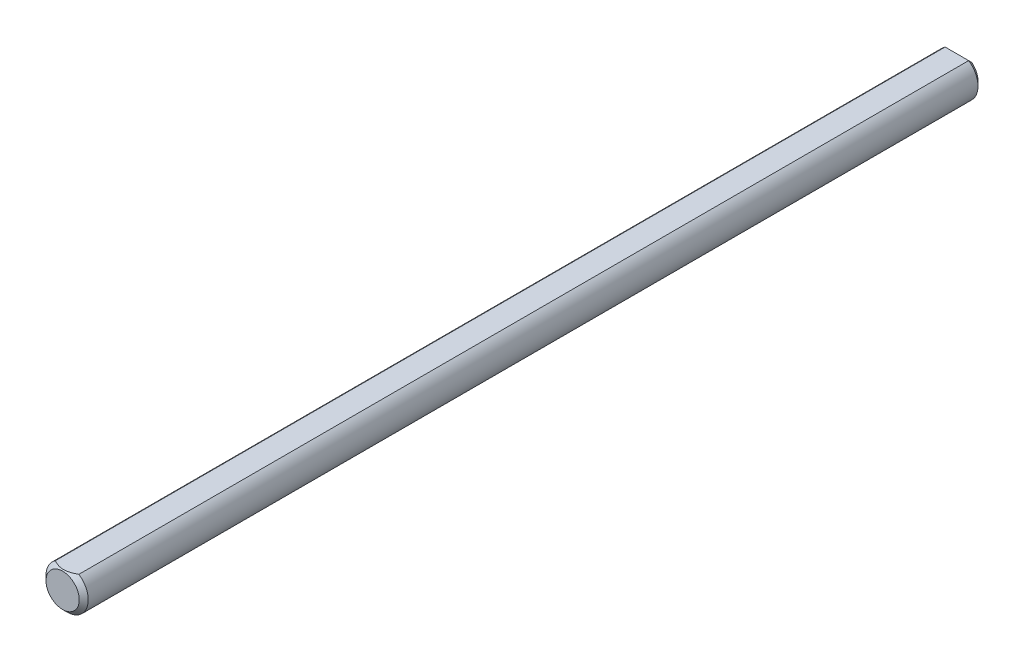
ISO-10303-21;
HEADER;
FILE_DESCRIPTION(('STEP AP214'),'2;1');
FILE_NAME('part.step','',(''),(''),'','','');
FILE_SCHEMA(('AUTOMOTIVE_DESIGN { 1 0 10303 214 1 1 1 1 }'));
ENDSEC;
DATA;
#1=APPLICATION_CONTEXT('core data for automotive mechanical design processes');
#2=APPLICATION_PROTOCOL_DEFINITION('international standard','automotive_design',2000,#1);
#3=PRODUCT_CONTEXT('',#1,'mechanical');
#4=PRODUCT('Part','Part','',(#3));
#5=PRODUCT_RELATED_PRODUCT_CATEGORY('part','',(#4));
#6=PRODUCT_DEFINITION_FORMATION('','',#4);
#7=PRODUCT_DEFINITION_CONTEXT('part definition',#1,'design');
#8=PRODUCT_DEFINITION('design','',#6,#7);
#9=PRODUCT_DEFINITION_SHAPE('','',#8);
#10=(LENGTH_UNIT() NAMED_UNIT(*) SI_UNIT(.MILLI.,.METRE.));
#11=(NAMED_UNIT(*) PLANE_ANGLE_UNIT() SI_UNIT($,.RADIAN.));
#12=(NAMED_UNIT(*) SI_UNIT($,.STERADIAN.) SOLID_ANGLE_UNIT());
#13=UNCERTAINTY_MEASURE_WITH_UNIT(LENGTH_MEASURE(1.E-05),#10,'distance_accuracy_value','');
#14=(GEOMETRIC_REPRESENTATION_CONTEXT(3) GLOBAL_UNCERTAINTY_ASSIGNED_CONTEXT((#13)) GLOBAL_UNIT_ASSIGNED_CONTEXT((#10,
#11,#12)) REPRESENTATION_CONTEXT('',''));
#15=CARTESIAN_POINT('',(0.,0.,0.));
#16=DIRECTION('',(0.,0.,1.));
#17=DIRECTION('',(1.,0.,0.));
#18=AXIS2_PLACEMENT_3D('',#15,#16,#17);
#19=CARTESIAN_POINT('',(0.,0.,100.));
#20=DIRECTION('',(0.,0.,1.));
#21=DIRECTION('',(1.,0.,0.));
#22=AXIS2_PLACEMENT_3D('',#19,#20,#21);
#23=PLANE('',#22);
#24=CARTESIAN_POINT('',(0.,0.,100.000000000023));
#25=DIRECTION('',(0.,0.,-1.));
#26=DIRECTION('',(0.,1.,0.));
#27=AXIS2_PLACEMENT_3D('',#24,#25,#26);
#28=CIRCLE('',#27,1.8500000000472);
#29=CARTESIAN_POINT('',(0.,1.8500000000472,100.000000000023));
#30=VERTEX_POINT('',#29);
#31=EDGE_CURVE('E91',#30,#30,#28,.T.);
#32=ORIENTED_EDGE('',*,*,#31,.F.);
#33=EDGE_LOOP('',(#32));
#34=FACE_BOUND('',#33,.T.);
#35=ADVANCED_FACE('F38',(#34),#23,.T.);
#36=CARTESIAN_POINT('',(-1.3114877048604,1.95,100.));
#37=DIRECTION('',(0.,-1.,0.));
#38=DIRECTION('',(0.,0.,-1.));
#39=AXIS2_PLACEMENT_3D('',#36,#37,#38);
#40=PLANE('',#39);
#41=DIRECTION('',(0.,0.,1.));
#42=VECTOR('',#41,1.);
#43=CARTESIAN_POINT('',(1.3114877048604,1.95,0.));
#44=LINE('',#43,#42);
#45=CARTESIAN_POINT('',(1.3114877048604,1.95,0.500000000005244));
#46=VERTEX_POINT('',#45);
#47=CARTESIAN_POINT('',(1.3114877048604,1.95,99.5000000000266));
#48=VERTEX_POINT('',#47);
#49=EDGE_CURVE('E76',#46,#48,#44,.T.);
#50=ORIENTED_EDGE('',*,*,#49,.F.);
#51=DIRECTION('',(-1.,0.,0.));
#52=VECTOR('',#51,1.);
#53=CARTESIAN_POINT('',(-1.3114877048604,1.95,0.500000000005246));
#54=LINE('',#53,#52);
#55=CARTESIAN_POINT('',(-1.3114877048604,1.95,0.500000000005244));
#56=VERTEX_POINT('',#55);
#57=EDGE_CURVE('E51',#46,#56,#54,.T.);
#58=ORIENTED_EDGE('',*,*,#57,.T.);
#59=DIRECTION('',(0.,0.,1.));
#60=VECTOR('',#59,1.);
#61=CARTESIAN_POINT('',(-1.3114877048604,1.95,0.));
#62=LINE('',#61,#60);
#63=CARTESIAN_POINT('',(-1.3114877048604,1.95,99.5000000000266));
#64=VERTEX_POINT('',#63);
#65=EDGE_CURVE('E84',#56,#64,#62,.T.);
#66=ORIENTED_EDGE('',*,*,#65,.T.);
#67=CARTESIAN_POINT('',(1.31148770489016,1.95,99.5000000000533));
#68=CARTESIAN_POINT('',(1.24183610950036,1.95,99.5388302583068));
#69=CARTESIAN_POINT('',(1.17125076491476,1.95,99.5761294449015));
#70=CARTESIAN_POINT('',(1.02772599304841,1.95,99.6466506244512));
#71=CARTESIAN_POINT('',(0.954778132493141,1.95,99.6798553526649));
#72=CARTESIAN_POINT('',(0.805849447639209,1.95,99.741148352104));
#73=CARTESIAN_POINT('',(0.729845233938377,1.95,99.7691808205907));
#74=CARTESIAN_POINT('',(0.57565175884547,1.95,99.8181166196262));
#75=CARTESIAN_POINT('',(0.497466177449191,1.95,99.8390312541502));
#76=CARTESIAN_POINT('',(0.361050160197794,1.95,99.8676494591081));
#77=CARTESIAN_POINT('',(0.303250371928107,1.95,99.8774048110798));
#78=CARTESIAN_POINT('',(0.187010295248576,1.95,99.8919011635841));
#79=CARTESIAN_POINT('',(0.128569983490544,1.95,99.8966419807098));
#80=CARTESIAN_POINT('',(0.0118826118988042,1.95,99.9008297651579));
#81=CARTESIAN_POINT('',(-0.0463631880214548,1.95,99.9003113721601));
#82=CARTESIAN_POINT('',(-0.162574259233057,1.95,99.8940958616333));
#83=CARTESIAN_POINT('',(-0.220539514135205,1.95,99.8883984451355));
#84=CARTESIAN_POINT('',(-0.349506743275955,1.95,99.8701843517875));
#85=CARTESIAN_POINT('',(-0.420325003831508,1.95,99.8563665503568));
#86=CARTESIAN_POINT('',(-0.560373444455244,1.95,99.8222195897124));
#87=CARTESIAN_POINT('',(-0.629602804706251,1.95,99.8018871466636));
#88=CARTESIAN_POINT('',(-0.766611192096458,1.95,99.7557206271044));
#89=CARTESIAN_POINT('',(-0.834379779552265,1.95,99.729856032056));
#90=CARTESIAN_POINT('',(-0.9680528919386,1.95,99.6737776504166));
#91=CARTESIAN_POINT('',(-1.0339578737386,1.95,99.6435649410372));
#92=CARTESIAN_POINT('',(-1.13502558973586,1.95,99.5939415891661));
#93=CARTESIAN_POINT('',(-1.17078447868798,1.95,99.5757260860882));
#94=CARTESIAN_POINT('',(-1.24159800812169,1.95,99.5384709093905));
#95=CARTESIAN_POINT('',(-1.2766555819023,1.95,99.5194368181365));
#96=CARTESIAN_POINT('',(-1.31148770489018,1.95,99.5000000000533));
#97=B_SPLINE_CURVE_WITH_KNOTS('',3,(#67,#68,#69,#70,#71,#72,#73,#74,#75,#76,#77,#78,#79,#80,#81,
#82,#83,#84,#85,#86,#87,#88,#89,#90,#91,#92,#93,#94,#95,#96),.UNSPECIFIED.,.F.,.F.,(4,2,2,2,2,2,
2,2,2,2,2,2,2,2,4),(0.,0.239318834393847,0.479614575414279,0.722367978526302,0.964734041150307,
1.14039135005688,1.31605508341342,1.49056256632792,1.66508012365582,1.88116962723278,
2.09736822685612,2.31479176782362,2.53216153622502,2.65254307691656,2.7722044550195),.UNSPECIFIED.);
#98=EDGE_CURVE('E88',#48,#64,#97,.T.);
#99=ORIENTED_EDGE('',*,*,#98,.F.);
#100=EDGE_LOOP('',(#50,#58,#66,#99));
#101=FACE_BOUND('',#100,.T.);
#102=ADVANCED_FACE('F93',(#101),#40,.F.);
#103=CARTESIAN_POINT('',(0.,0.,99.5000000000346));
#104=DIRECTION('',(0.,0.,-1.));
#105=DIRECTION('',(0.,1.,0.));
#106=AXIS2_PLACEMENT_3D('',#103,#104,#105);
#107=CONICAL_SURFACE('',#106,2.35000000003538,0.785398163397448);
#108=ORIENTED_EDGE('',*,*,#31,.T.);
#109=EDGE_LOOP('',(#108));
#110=FACE_BOUND('',#109,.T.);
#111=CARTESIAN_POINT('',(0.,0.,99.5));
#112=DIRECTION('',(0.,0.,-1.));
#113=DIRECTION('',(-1.,0.,0.));
#114=AXIS2_PLACEMENT_3D('',#111,#112,#113);
#115=CIRCLE('',#114,2.35);
#116=EDGE_CURVE('E79',#48,#64,#115,.T.);
#117=ORIENTED_EDGE('',*,*,#116,.F.);
#118=ORIENTED_EDGE('',*,*,#98,.T.);
#119=EDGE_LOOP('',(#117,#118));
#120=FACE_BOUND('',#119,.T.);
#121=ADVANCED_FACE('F87',(#110,#120),#107,.T.);
#122=CARTESIAN_POINT('',(0.,0.,0.));
#123=DIRECTION('',(0.,0.,1.));
#124=DIRECTION('',(1.,0.,0.));
#125=AXIS2_PLACEMENT_3D('',#122,#123,#124);
#126=CYLINDRICAL_SURFACE('',#125,2.35);
#127=ORIENTED_EDGE('',*,*,#65,.F.);
#128=CARTESIAN_POINT('',(0.,0.,0.500000000005244));
#129=DIRECTION('',(0.,0.,1.));
#130=DIRECTION('',(1.,0.,0.));
#131=AXIS2_PLACEMENT_3D('',#128,#129,#130);
#132=CIRCLE('',#131,2.35);
#133=EDGE_CURVE('E12',#56,#46,#132,.T.);
#134=ORIENTED_EDGE('',*,*,#133,.T.);
#135=ORIENTED_EDGE('',*,*,#49,.T.);
#136=ORIENTED_EDGE('',*,*,#116,.T.);
#137=EDGE_LOOP('',(#127,#134,#135,#136));
#138=FACE_BOUND('',#137,.T.);
#139=ADVANCED_FACE('F78',(#138),#126,.T.);
#140=CARTESIAN_POINT('',(0.,0.,0.));
#141=DIRECTION('',(0.,0.,1.));
#142=DIRECTION('',(1.,0.,0.));
#143=AXIS2_PLACEMENT_3D('',#140,#141,#142);
#144=PLANE('',#143);
#145=CARTESIAN_POINT('',(0.,0.,0.));
#146=DIRECTION('',(0.,0.,1.));
#147=DIRECTION('',(1.,0.,0.));
#148=AXIS2_PLACEMENT_3D('',#145,#146,#147);
#149=CIRCLE('',#148,1.84999999999476);
#150=CARTESIAN_POINT('',(1.14891252930578,1.44999999999476,0.));
#151=VERTEX_POINT('',#150);
#152=CARTESIAN_POINT('',(-1.14891252930578,1.44999999999476,0.));
#153=VERTEX_POINT('',#152);
#154=EDGE_CURVE('E90',#151,#153,#149,.F.);
#155=ORIENTED_EDGE('',*,*,#154,.T.);
#156=DIRECTION('',(1.,0.,0.));
#157=VECTOR('',#156,1.);
#158=CARTESIAN_POINT('',(0.,1.44999999999476,0.));
#159=LINE('',#158,#157);
#160=EDGE_CURVE('E131',#153,#151,#159,.T.);
#161=ORIENTED_EDGE('',*,*,#160,.T.);
#162=EDGE_LOOP('',(#155,#161));
#163=FACE_BOUND('',#162,.T.);
#164=ADVANCED_FACE('F121',(#163),#144,.F.);
#165=CARTESIAN_POINT('',(0.,0.,0.));
#166=DIRECTION('',(0.,0.,1.));
#167=DIRECTION('',(1.,0.,0.));
#168=AXIS2_PLACEMENT_3D('',#165,#166,#167);
#169=CONICAL_SURFACE('',#168,1.84999999999476,0.785398163397445);
#170=CARTESIAN_POINT('',(1.14891252930578,1.44999999999476,0.));
#171=CARTESIAN_POINT('',(1.16336566940741,1.49151749073235,0.0415174907375959));
#172=CARTESIAN_POINT('',(1.17756419590088,1.53307901095707,0.0830790109623081));
#173=CARTESIAN_POINT('',(1.20549504206736,1.61627806357431,0.166278063579554));
#174=CARTESIAN_POINT('',(1.21922738596568,1.65791559189821,0.207915591903451));
#175=CARTESIAN_POINT('',(1.24627018221947,1.74125831979532,0.29125831980056));
#176=CARTESIAN_POINT('',(1.25958064082594,1.78296351835624,0.33296351836148));
#177=CARTESIAN_POINT('',(1.28581534056285,1.86643691357638,0.416436913581626));
#178=CARTESIAN_POINT('',(1.29873956157239,1.90820511339898,0.458205113404223));
#179=CARTESIAN_POINT('',(1.3114877048604,1.95,0.500000000005245));
#180=B_SPLINE_CURVE_WITH_KNOTS('',3,(#170,#171,#172,#173,#174,#175,#176,#177,#178,#179),
.UNSPECIFIED.,.F.,.F.,(4,2,2,2,4),(0.,0.181400833813068,0.362792226606751,0.544180930497601,
0.725579067347127),.UNSPECIFIED.);
#181=EDGE_CURVE('E133',#46,#151,#180,.F.);
#182=ORIENTED_EDGE('',*,*,#181,.F.);
#183=ORIENTED_EDGE('',*,*,#133,.F.);
#184=CARTESIAN_POINT('',(-1.3114877048604,1.95,0.500000000005245));
#185=CARTESIAN_POINT('',(-1.29873956157239,1.90820511339898,0.458205113404223));
#186=CARTESIAN_POINT('',(-1.28581534056285,1.86643691357638,0.416436913581626));
#187=CARTESIAN_POINT('',(-1.25958064082594,1.78296351835624,0.33296351836148));
#188=CARTESIAN_POINT('',(-1.24627018221947,1.74125831979532,0.29125831980056));
#189=CARTESIAN_POINT('',(-1.21922738596568,1.65791559189821,0.207915591903451));
#190=CARTESIAN_POINT('',(-1.20549504206736,1.61627806357431,0.166278063579554));
#191=CARTESIAN_POINT('',(-1.17756419590088,1.53307901095707,0.0830790109623081));
#192=CARTESIAN_POINT('',(-1.16336566940741,1.49151749073235,0.041517490737596));
#193=CARTESIAN_POINT('',(-1.14891252930578,1.44999999999476,0.));
#194=B_SPLINE_CURVE_WITH_KNOTS('',3,(#184,#185,#186,#187,#188,#189,#190,#191,#192,#193),
.UNSPECIFIED.,.F.,.F.,(4,2,2,2,4),(0.,0.181398136849526,0.362786840740377,0.544178233534059,
0.725579067347127),.UNSPECIFIED.);
#195=EDGE_CURVE('E43',#153,#56,#194,.F.);
#196=ORIENTED_EDGE('',*,*,#195,.F.);
#197=ORIENTED_EDGE('',*,*,#154,.F.);
#198=EDGE_LOOP('',(#182,#183,#196,#197));
#199=FACE_BOUND('',#198,.T.);
#200=ADVANCED_FACE('F123',(#199),#169,.T.);
#201=CARTESIAN_POINT('',(0.,1.44999999999476,0.));
#202=DIRECTION('',(0.,-0.707106781186551,0.707106781186544));
#203=DIRECTION('',(1.,0.,0.));
#204=AXIS2_PLACEMENT_3D('',#201,#202,#203);
#205=PLANE('',#204);
#206=ORIENTED_EDGE('',*,*,#195,.T.);
#207=ORIENTED_EDGE('',*,*,#57,.F.);
#208=ORIENTED_EDGE('',*,*,#181,.T.);
#209=ORIENTED_EDGE('',*,*,#160,.F.);
#210=EDGE_LOOP('',(#206,#207,#208,#209));
#211=FACE_BOUND('',#210,.T.);
#212=ADVANCED_FACE('F40',(#211),#205,.F.);
#213=CLOSED_SHELL('',(#35,#102,#121,#139,#164,#200,#212));
#214=MANIFOLD_SOLID_BREP('B2',#213);
#215=ADVANCED_BREP_SHAPE_REPRESENTATION('',(#18,#214),#14);
#216=SHAPE_DEFINITION_REPRESENTATION(#9,#215);
ENDSEC;
END-ISO-10303-21;
